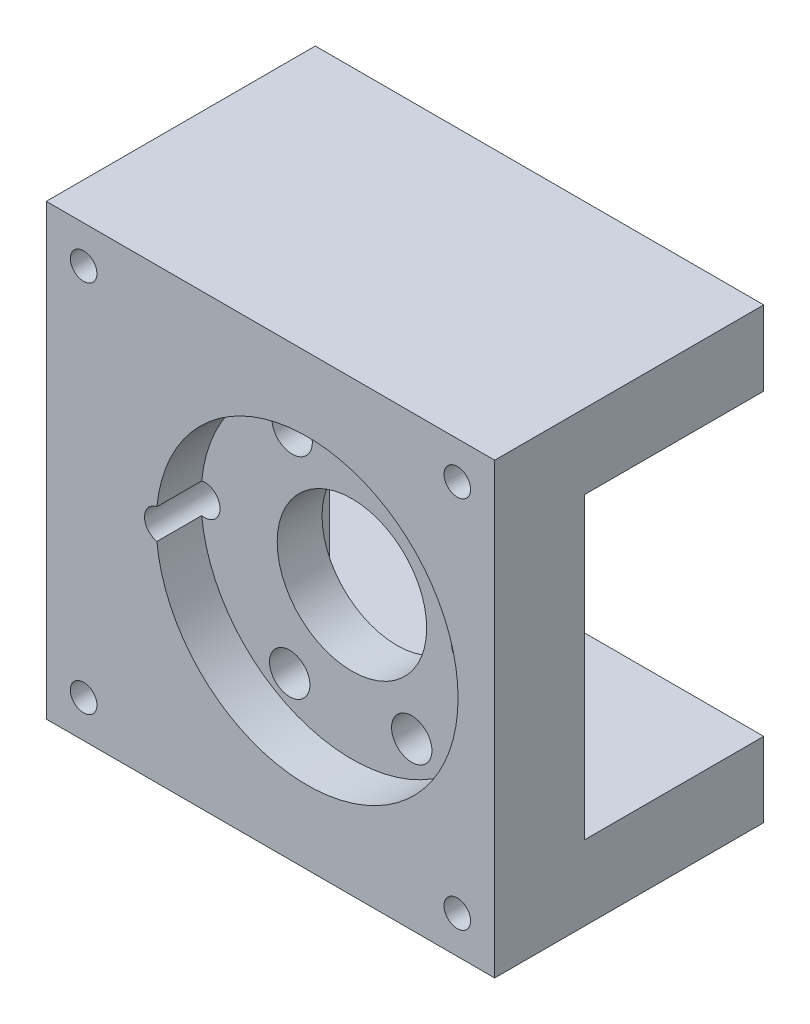
ISO-10303-21;
HEADER;
FILE_DESCRIPTION(('STEP AP214'),'2;1');
FILE_NAME('part.step','',(''),(''),'','','');
FILE_SCHEMA(('AUTOMOTIVE_DESIGN { 1 0 10303 214 1 1 1 1 }'));
ENDSEC;
DATA;
#1=APPLICATION_CONTEXT('core data for automotive mechanical design processes');
#2=APPLICATION_PROTOCOL_DEFINITION('international standard','automotive_design',2000,#1);
#3=PRODUCT_CONTEXT('',#1,'mechanical');
#4=PRODUCT('Part','Part','',(#3));
#5=PRODUCT_RELATED_PRODUCT_CATEGORY('part','',(#4));
#6=PRODUCT_DEFINITION_FORMATION('','',#4);
#7=PRODUCT_DEFINITION_CONTEXT('part definition',#1,'design');
#8=PRODUCT_DEFINITION('design','',#6,#7);
#9=PRODUCT_DEFINITION_SHAPE('','',#8);
#10=(LENGTH_UNIT() NAMED_UNIT(*) SI_UNIT(.MILLI.,.METRE.));
#11=(NAMED_UNIT(*) PLANE_ANGLE_UNIT() SI_UNIT($,.RADIAN.));
#12=(NAMED_UNIT(*) SI_UNIT($,.STERADIAN.) SOLID_ANGLE_UNIT());
#13=UNCERTAINTY_MEASURE_WITH_UNIT(LENGTH_MEASURE(1.E-05),#10,'distance_accuracy_value','');
#14=(GEOMETRIC_REPRESENTATION_CONTEXT(3) GLOBAL_UNCERTAINTY_ASSIGNED_CONTEXT((#13)) GLOBAL_UNIT_ASSIGNED_CONTEXT((#10,
#11,#12)) REPRESENTATION_CONTEXT('',''));
#15=CARTESIAN_POINT('',(0.,0.,0.));
#16=DIRECTION('',(0.,0.,1.));
#17=DIRECTION('',(1.,0.,0.));
#18=AXIS2_PLACEMENT_3D('',#15,#16,#17);
#19=CARTESIAN_POINT('',(0.,0.,9.));
#20=DIRECTION('',(0.,0.,-1.));
#21=DIRECTION('',(-1.,0.,0.));
#22=AXIS2_PLACEMENT_3D('',#19,#20,#21);
#23=PLANE('',#22);
#24=CARTESIAN_POINT('',(7.599999986,0.,9.));
#25=DIRECTION('',(0.,0.,-1.));
#26=DIRECTION('',(-1.,0.,0.));
#27=AXIS2_PLACEMENT_3D('',#24,#25,#26);
#28=CIRCLE('',#27,2.);
#29=CARTESIAN_POINT('',(5.599999986,0.,9.));
#30=VERTEX_POINT('',#29);
#31=EDGE_CURVE('E180',#30,#30,#28,.T.);
#32=ORIENTED_EDGE('',*,*,#31,.F.);
#33=EDGE_LOOP('',(#32));
#34=FACE_BOUND('',#33,.T.);
#35=DIRECTION('',(1.,0.,0.));
#36=VECTOR('',#35,1.);
#37=CARTESIAN_POINT('',(30.,10.,9.));
#38=LINE('',#37,#36);
#39=CARTESIAN_POINT('',(0.,10.,9.));
#40=VERTEX_POINT('',#39);
#41=CARTESIAN_POINT('',(13.251999944,10.,9.));
#42=VERTEX_POINT('',#41);
#43=EDGE_CURVE('E56',#40,#42,#38,.T.);
#44=ORIENTED_EDGE('',*,*,#43,.T.);
#45=CARTESIAN_POINT('',(13.251999944,6.698,9.));
#46=DIRECTION('',(0.,0.,-1.));
#47=DIRECTION('',(-1.,0.,0.));
#48=AXIS2_PLACEMENT_3D('',#45,#46,#47);
#49=CIRCLE('',#48,3.302);
#50=CARTESIAN_POINT('',(9.949999944,6.698,9.));
#51=VERTEX_POINT('',#50);
#52=EDGE_CURVE('E12',#42,#51,#49,.F.);
#53=ORIENTED_EDGE('',*,*,#52,.T.);
#54=DIRECTION('',(0.,-1.,0.));
#55=VECTOR('',#54,1.);
#56=CARTESIAN_POINT('',(9.949999944,0.,9.));
#57=LINE('',#56,#55);
#58=CARTESIAN_POINT('',(9.949999944,-6.698,9.));
#59=VERTEX_POINT('',#58);
#60=EDGE_CURVE('E173',#51,#59,#57,.T.);
#61=ORIENTED_EDGE('',*,*,#60,.T.);
#62=CARTESIAN_POINT('',(13.251999944,-6.698,9.));
#63=DIRECTION('',(0.,0.,-1.));
#64=DIRECTION('',(-1.,0.,0.));
#65=AXIS2_PLACEMENT_3D('',#62,#63,#64);
#66=CIRCLE('',#65,3.302);
#67=CARTESIAN_POINT('',(13.251999944,-10.,9.));
#68=VERTEX_POINT('',#67);
#69=EDGE_CURVE('E50',#59,#68,#66,.F.);
#70=ORIENTED_EDGE('',*,*,#69,.T.);
#71=DIRECTION('',(-1.,0.,0.));
#72=VECTOR('',#71,1.);
#73=CARTESIAN_POINT('',(30.,-10.,9.));
#74=LINE('',#73,#72);
#75=CARTESIAN_POINT('',(0.,-10.,9.));
#76=VERTEX_POINT('',#75);
#77=EDGE_CURVE('E228',#68,#76,#74,.T.);
#78=ORIENTED_EDGE('',*,*,#77,.T.);
#79=DIRECTION('',(0.,1.,0.));
#80=VECTOR('',#79,1.);
#81=CARTESIAN_POINT('',(0.,10.,9.));
#82=LINE('',#81,#80);
#83=EDGE_CURVE('E230',#76,#40,#82,.T.);
#84=ORIENTED_EDGE('',*,*,#83,.T.);
#85=EDGE_LOOP('',(#44,#53,#61,#70,#78,#84));
#86=FACE_BOUND('',#85,.T.);
#87=ADVANCED_FACE('F42',(#34,#86),#23,.T.);
#88=CARTESIAN_POINT('',(17.449999944,0.,18.));
#89=DIRECTION('',(0.,0.,-1.));
#90=DIRECTION('',(-1.,0.,0.));
#91=AXIS2_PLACEMENT_3D('',#88,#89,#90);
#92=CYLINDRICAL_SURFACE('',#91,5.);
#93=CARTESIAN_POINT('',(17.449999944,0.,11.999999892));
#94=DIRECTION('',(0.,0.,1.));
#95=DIRECTION('',(1.,0.,0.));
#96=AXIS2_PLACEMENT_3D('',#93,#94,#95);
#97=CIRCLE('',#96,5.);
#98=CARTESIAN_POINT('',(22.449999944,0.,11.999999892));
#99=VERTEX_POINT('',#98);
#100=EDGE_CURVE('E167',#99,#99,#97,.T.);
#101=ORIENTED_EDGE('',*,*,#100,.F.);
#102=EDGE_LOOP('',(#101));
#103=FACE_BOUND('',#102,.T.);
#104=CARTESIAN_POINT('',(17.449999944,0.,15.));
#105=DIRECTION('',(0.,0.,1.));
#106=DIRECTION('',(1.,0.,0.));
#107=AXIS2_PLACEMENT_3D('',#104,#105,#106);
#108=CIRCLE('',#107,5.);
#109=CARTESIAN_POINT('',(22.449999944,0.,15.));
#110=VERTEX_POINT('',#109);
#111=EDGE_CURVE('E191',#110,#110,#108,.T.);
#112=ORIENTED_EDGE('',*,*,#111,.T.);
#113=EDGE_LOOP('',(#112));
#114=FACE_BOUND('',#113,.T.);
#115=ADVANCED_FACE('F338',(#103,#114),#92,.F.);
#116=CARTESIAN_POINT('',(7.599999986,0.,18.));
#117=DIRECTION('',(0.,0.,-1.));
#118=DIRECTION('',(-1.,0.,0.));
#119=AXIS2_PLACEMENT_3D('',#116,#117,#118);
#120=CYLINDRICAL_SURFACE('',#119,1.025);
#121=DIRECTION('',(0.,0.,1.));
#122=VECTOR('',#121,1.);
#123=CARTESIAN_POINT('',(7.40015857258951,-1.00533000029149,-28.531668498232));
#124=LINE('',#123,#122);
#125=CARTESIAN_POINT('',(7.40015857258951,-1.00533000029149,15.));
#126=VERTEX_POINT('',#125);
#127=CARTESIAN_POINT('',(7.40015857258951,-1.00533000029149,18.));
#128=VERTEX_POINT('',#127);
#129=EDGE_CURVE('E192',#126,#128,#124,.T.);
#130=ORIENTED_EDGE('',*,*,#129,.F.);
#131=CARTESIAN_POINT('',(7.599999986,0.,15.));
#132=DIRECTION('',(0.,0.,1.));
#133=DIRECTION('',(1.,0.,0.));
#134=AXIS2_PLACEMENT_3D('',#131,#132,#133);
#135=CIRCLE('',#134,1.025);
#136=CARTESIAN_POINT('',(7.40015857258951,1.00533000029149,15.));
#137=VERTEX_POINT('',#136);
#138=EDGE_CURVE('E193',#126,#137,#135,.T.);
#139=ORIENTED_EDGE('',*,*,#138,.T.);
#140=DIRECTION('',(0.,0.,1.));
#141=VECTOR('',#140,1.);
#142=CARTESIAN_POINT('',(7.40015857258951,1.00533000029149,-28.531668498232));
#143=LINE('',#142,#141);
#144=CARTESIAN_POINT('',(7.40015857258951,1.00533000029149,18.));
#145=VERTEX_POINT('',#144);
#146=EDGE_CURVE('E188',#137,#145,#143,.T.);
#147=ORIENTED_EDGE('',*,*,#146,.T.);
#148=CARTESIAN_POINT('',(7.599999986,0.,18.));
#149=DIRECTION('',(0.,0.,1.));
#150=DIRECTION('',(1.,0.,0.));
#151=AXIS2_PLACEMENT_3D('',#148,#149,#150);
#152=CIRCLE('',#151,1.025);
#153=EDGE_CURVE('E255',#145,#128,#152,.T.);
#154=ORIENTED_EDGE('',*,*,#153,.T.);
#155=EDGE_LOOP('',(#130,#139,#147,#154));
#156=FACE_BOUND('',#155,.T.);
#157=CARTESIAN_POINT('',(7.599999986,0.,8.6));
#158=DIRECTION('',(0.,0.,1.));
#159=DIRECTION('',(1.,0.,0.));
#160=AXIS2_PLACEMENT_3D('',#157,#158,#159);
#161=CIRCLE('',#160,1.025);
#162=CARTESIAN_POINT('',(8.624999986,0.,8.6));
#163=VERTEX_POINT('',#162);
#164=EDGE_CURVE('E183',#163,#163,#161,.T.);
#165=ORIENTED_EDGE('',*,*,#164,.F.);
#166=EDGE_LOOP('',(#165));
#167=FACE_BOUND('',#166,.T.);
#168=ADVANCED_FACE('F344',(#156,#167),#120,.F.);
#169=CARTESIAN_POINT('',(0.,0.,0.));
#170=DIRECTION('',(0.,0.,1.));
#171=DIRECTION('',(1.,0.,0.));
#172=AXIS2_PLACEMENT_3D('',#169,#170,#171);
#173=PLANE('',#172);
#174=CARTESIAN_POINT('',(27.5,12.5,0.));
#175=DIRECTION('',(0.,0.,-1.));
#176=DIRECTION('',(-1.,0.,0.));
#177=AXIS2_PLACEMENT_3D('',#174,#175,#176);
#178=CIRCLE('',#177,0.888999999999987);
#179=CARTESIAN_POINT('',(26.611,12.5,0.));
#180=VERTEX_POINT('',#179);
#181=EDGE_CURVE('E196',#180,#180,#178,.T.);
#182=ORIENTED_EDGE('',*,*,#181,.F.);
#183=EDGE_LOOP('',(#182));
#184=FACE_BOUND('',#183,.T.);
#185=CARTESIAN_POINT('',(2.5,12.5,0.));
#186=DIRECTION('',(0.,0.,-1.));
#187=DIRECTION('',(-1.,0.,0.));
#188=AXIS2_PLACEMENT_3D('',#185,#186,#187);
#189=CIRCLE('',#188,0.888999999999987);
#190=CARTESIAN_POINT('',(1.61100000000001,12.5,0.));
#191=VERTEX_POINT('',#190);
#192=EDGE_CURVE('E221',#191,#191,#189,.T.);
#193=ORIENTED_EDGE('',*,*,#192,.F.);
#194=EDGE_LOOP('',(#193));
#195=FACE_BOUND('',#194,.T.);
#196=DIRECTION('',(0.,1.,0.));
#197=VECTOR('',#196,1.);
#198=CARTESIAN_POINT('',(30.,0.,0.));
#199=LINE('',#198,#197);
#200=CARTESIAN_POINT('',(30.,10.,0.));
#201=VERTEX_POINT('',#200);
#202=CARTESIAN_POINT('',(30.,15.,0.));
#203=VERTEX_POINT('',#202);
#204=EDGE_CURVE('E261',#201,#203,#199,.T.);
#205=ORIENTED_EDGE('',*,*,#204,.F.);
#206=DIRECTION('',(1.,0.,0.));
#207=VECTOR('',#206,1.);
#208=CARTESIAN_POINT('',(30.,10.,0.));
#209=LINE('',#208,#207);
#210=CARTESIAN_POINT('',(0.,10.,0.));
#211=VERTEX_POINT('',#210);
#212=EDGE_CURVE('E231',#211,#201,#209,.T.);
#213=ORIENTED_EDGE('',*,*,#212,.F.);
#214=DIRECTION('',(0.,1.,0.));
#215=VECTOR('',#214,1.);
#216=CARTESIAN_POINT('',(0.,0.,0.));
#217=LINE('',#216,#215);
#218=CARTESIAN_POINT('',(0.,15.,0.));
#219=VERTEX_POINT('',#218);
#220=EDGE_CURVE('E266',#211,#219,#217,.T.);
#221=ORIENTED_EDGE('',*,*,#220,.T.);
#222=DIRECTION('',(1.,0.,0.));
#223=VECTOR('',#222,1.);
#224=CARTESIAN_POINT('',(0.,15.,0.));
#225=LINE('',#224,#223);
#226=EDGE_CURVE('E263',#219,#203,#225,.T.);
#227=ORIENTED_EDGE('',*,*,#226,.T.);
#228=EDGE_LOOP('',(#205,#213,#221,#227));
#229=FACE_BOUND('',#228,.T.);
#230=ADVANCED_FACE('F307',(#184,#195,#229),#173,.F.);
#231=CARTESIAN_POINT('',(0.,-15.,18.));
#232=DIRECTION('',(0.,1.,0.));
#233=DIRECTION('',(0.,0.,1.));
#234=AXIS2_PLACEMENT_3D('',#231,#232,#233);
#235=PLANE('',#234);
#236=DIRECTION('',(1.,0.,0.));
#237=VECTOR('',#236,1.);
#238=CARTESIAN_POINT('',(0.,-15.,0.));
#239=LINE('',#238,#237);
#240=CARTESIAN_POINT('',(0.,-15.,0.));
#241=VERTEX_POINT('',#240);
#242=CARTESIAN_POINT('',(30.,-15.,0.));
#243=VERTEX_POINT('',#242);
#244=EDGE_CURVE('E238',#241,#243,#239,.T.);
#245=ORIENTED_EDGE('',*,*,#244,.T.);
#246=DIRECTION('',(0.,0.,-1.));
#247=VECTOR('',#246,1.);
#248=CARTESIAN_POINT('',(30.,-15.,18.));
#249=LINE('',#248,#247);
#250=CARTESIAN_POINT('',(30.,-15.,18.));
#251=VERTEX_POINT('',#250);
#252=EDGE_CURVE('E276',#251,#243,#249,.T.);
#253=ORIENTED_EDGE('',*,*,#252,.F.);
#254=DIRECTION('',(1.,0.,0.));
#255=VECTOR('',#254,1.);
#256=CARTESIAN_POINT('',(0.,-15.,18.));
#257=LINE('',#256,#255);
#258=CARTESIAN_POINT('',(0.,-15.,18.));
#259=VERTEX_POINT('',#258);
#260=EDGE_CURVE('E243',#259,#251,#257,.T.);
#261=ORIENTED_EDGE('',*,*,#260,.F.);
#262=DIRECTION('',(0.,0.,-1.));
#263=VECTOR('',#262,1.);
#264=CARTESIAN_POINT('',(0.,-15.,18.));
#265=LINE('',#264,#263);
#266=EDGE_CURVE('E258',#259,#241,#265,.T.);
#267=ORIENTED_EDGE('',*,*,#266,.T.);
#268=EDGE_LOOP('',(#245,#253,#261,#267));
#269=FACE_BOUND('',#268,.T.);
#270=ADVANCED_FACE('F319',(#269),#235,.F.);
#271=CARTESIAN_POINT('',(30.,0.,18.));
#272=DIRECTION('',(-1.,0.,0.));
#273=DIRECTION('',(0.,0.,1.));
#274=AXIS2_PLACEMENT_3D('',#271,#272,#273);
#275=PLANE('',#274);
#276=DIRECTION('',(0.,-1.,0.));
#277=VECTOR('',#276,1.);
#278=CARTESIAN_POINT('',(30.,0.,11.999999892));
#279=LINE('',#278,#277);
#280=CARTESIAN_POINT('',(30.,10.,11.999999892));
#281=VERTEX_POINT('',#280);
#282=CARTESIAN_POINT('',(30.,-10.,11.999999892));
#283=VERTEX_POINT('',#282);
#284=EDGE_CURVE('E148',#281,#283,#279,.T.);
#285=ORIENTED_EDGE('',*,*,#284,.F.);
#286=DIRECTION('',(0.,0.,-1.));
#287=VECTOR('',#286,1.);
#288=CARTESIAN_POINT('',(30.,10.,9.));
#289=LINE('',#288,#287);
#290=EDGE_CURVE('E236',#281,#201,#289,.T.);
#291=ORIENTED_EDGE('',*,*,#290,.T.);
#292=ORIENTED_EDGE('',*,*,#204,.T.);
#293=DIRECTION('',(0.,0.,-1.));
#294=VECTOR('',#293,1.);
#295=CARTESIAN_POINT('',(30.,15.,18.));
#296=LINE('',#295,#294);
#297=CARTESIAN_POINT('',(30.,15.,18.));
#298=VERTEX_POINT('',#297);
#299=EDGE_CURVE('E273',#298,#203,#296,.T.);
#300=ORIENTED_EDGE('',*,*,#299,.F.);
#301=DIRECTION('',(0.,1.,0.));
#302=VECTOR('',#301,1.);
#303=CARTESIAN_POINT('',(30.,0.,18.));
#304=LINE('',#303,#302);
#305=EDGE_CURVE('E246',#251,#298,#304,.T.);
#306=ORIENTED_EDGE('',*,*,#305,.F.);
#307=ORIENTED_EDGE('',*,*,#252,.T.);
#308=CARTESIAN_POINT('',(30.,-10.,0.));
#309=VERTEX_POINT('',#308);
#310=EDGE_CURVE('E150',#243,#309,#199,.T.);
#311=ORIENTED_EDGE('',*,*,#310,.T.);
#312=DIRECTION('',(0.,0.,-1.));
#313=VECTOR('',#312,1.);
#314=CARTESIAN_POINT('',(30.,-10.,9.));
#315=LINE('',#314,#313);
#316=EDGE_CURVE('E143',#283,#309,#315,.T.);
#317=ORIENTED_EDGE('',*,*,#316,.F.);
#318=EDGE_LOOP('',(#285,#291,#292,#300,#306,#307,#311,#317));
#319=FACE_BOUND('',#318,.T.);
#320=ADVANCED_FACE('F145',(#319),#275,.F.);
#321=CARTESIAN_POINT('',(0.,15.,18.));
#322=DIRECTION('',(0.,1.,0.));
#323=DIRECTION('',(0.,0.,1.));
#324=AXIS2_PLACEMENT_3D('',#321,#322,#323);
#325=PLANE('',#324);
#326=ORIENTED_EDGE('',*,*,#226,.F.);
#327=DIRECTION('',(0.,0.,-1.));
#328=VECTOR('',#327,1.);
#329=CARTESIAN_POINT('',(0.,15.,18.));
#330=LINE('',#329,#328);
#331=CARTESIAN_POINT('',(0.,15.,18.));
#332=VERTEX_POINT('',#331);
#333=EDGE_CURVE('E270',#332,#219,#330,.T.);
#334=ORIENTED_EDGE('',*,*,#333,.F.);
#335=DIRECTION('',(1.,0.,0.));
#336=VECTOR('',#335,1.);
#337=CARTESIAN_POINT('',(0.,15.,18.));
#338=LINE('',#337,#336);
#339=EDGE_CURVE('E249',#332,#298,#338,.T.);
#340=ORIENTED_EDGE('',*,*,#339,.T.);
#341=ORIENTED_EDGE('',*,*,#299,.T.);
#342=EDGE_LOOP('',(#326,#334,#340,#341));
#343=FACE_BOUND('',#342,.T.);
#344=ADVANCED_FACE('F311',(#343),#325,.T.);
#345=CARTESIAN_POINT('',(0.,0.,18.));
#346=DIRECTION('',(-1.,0.,0.));
#347=DIRECTION('',(0.,0.,1.));
#348=AXIS2_PLACEMENT_3D('',#345,#346,#347);
#349=PLANE('',#348);
#350=DIRECTION('',(0.,0.,-1.));
#351=VECTOR('',#350,1.);
#352=CARTESIAN_POINT('',(0.,10.,9.));
#353=LINE('',#352,#351);
#354=EDGE_CURVE('E239',#40,#211,#353,.T.);
#355=ORIENTED_EDGE('',*,*,#354,.F.);
#356=ORIENTED_EDGE('',*,*,#83,.F.);
#357=DIRECTION('',(0.,0.,-1.));
#358=VECTOR('',#357,1.);
#359=CARTESIAN_POINT('',(0.,-10.,9.));
#360=LINE('',#359,#358);
#361=CARTESIAN_POINT('',(0.,-10.,0.));
#362=VERTEX_POINT('',#361);
#363=EDGE_CURVE('E153',#76,#362,#360,.T.);
#364=ORIENTED_EDGE('',*,*,#363,.T.);
#365=EDGE_CURVE('E247',#241,#362,#217,.T.);
#366=ORIENTED_EDGE('',*,*,#365,.F.);
#367=ORIENTED_EDGE('',*,*,#266,.F.);
#368=DIRECTION('',(0.,1.,0.));
#369=VECTOR('',#368,1.);
#370=CARTESIAN_POINT('',(0.,0.,18.));
#371=LINE('',#370,#369);
#372=EDGE_CURVE('E252',#259,#332,#371,.T.);
#373=ORIENTED_EDGE('',*,*,#372,.T.);
#374=ORIENTED_EDGE('',*,*,#333,.T.);
#375=ORIENTED_EDGE('',*,*,#220,.F.);
#376=EDGE_LOOP('',(#355,#356,#364,#366,#367,#373,#374,#375));
#377=FACE_BOUND('',#376,.T.);
#378=ADVANCED_FACE('F325',(#377),#349,.T.);
#379=CARTESIAN_POINT('',(0.,0.,18.));
#380=DIRECTION('',(0.,0.,1.));
#381=DIRECTION('',(1.,0.,0.));
#382=AXIS2_PLACEMENT_3D('',#379,#380,#381);
#383=PLANE('',#382);
#384=CARTESIAN_POINT('',(17.449999944,0.,18.));
#385=DIRECTION('',(0.,0.,1.));
#386=DIRECTION('',(1.,0.,0.));
#387=AXIS2_PLACEMENT_3D('',#384,#385,#386);
#388=CIRCLE('',#387,10.1);
#389=EDGE_CURVE('E189',#128,#145,#388,.T.);
#390=ORIENTED_EDGE('',*,*,#389,.F.);
#391=ORIENTED_EDGE('',*,*,#153,.F.);
#392=EDGE_LOOP('',(#390,#391));
#393=FACE_BOUND('',#392,.T.);
#394=CARTESIAN_POINT('',(27.5,12.5,18.));
#395=DIRECTION('',(0.,0.,-1.));
#396=DIRECTION('',(-1.,0.,0.));
#397=AXIS2_PLACEMENT_3D('',#394,#395,#396);
#398=CIRCLE('',#397,0.888999999999997);
#399=CARTESIAN_POINT('',(26.611,12.5,18.));
#400=VERTEX_POINT('',#399);
#401=EDGE_CURVE('E206',#400,#400,#398,.T.);
#402=ORIENTED_EDGE('',*,*,#401,.T.);
#403=EDGE_LOOP('',(#402));
#404=FACE_BOUND('',#403,.T.);
#405=CARTESIAN_POINT('',(27.5,-12.5,18.));
#406=DIRECTION('',(0.,0.,-1.));
#407=DIRECTION('',(-1.,0.,0.));
#408=AXIS2_PLACEMENT_3D('',#405,#406,#407);
#409=CIRCLE('',#408,0.888999999999997);
#410=CARTESIAN_POINT('',(26.611,-12.5,18.));
#411=VERTEX_POINT('',#410);
#412=EDGE_CURVE('E212',#411,#411,#409,.T.);
#413=ORIENTED_EDGE('',*,*,#412,.T.);
#414=EDGE_LOOP('',(#413));
#415=FACE_BOUND('',#414,.T.);
#416=CARTESIAN_POINT('',(2.5,-12.5,18.));
#417=DIRECTION('',(0.,0.,-1.));
#418=DIRECTION('',(-1.,0.,0.));
#419=AXIS2_PLACEMENT_3D('',#416,#417,#418);
#420=CIRCLE('',#419,0.888999999999997);
#421=CARTESIAN_POINT('',(1.611,-12.5,18.));
#422=VERTEX_POINT('',#421);
#423=EDGE_CURVE('E218',#422,#422,#420,.T.);
#424=ORIENTED_EDGE('',*,*,#423,.T.);
#425=EDGE_LOOP('',(#424));
#426=FACE_BOUND('',#425,.T.);
#427=CARTESIAN_POINT('',(2.5,12.5,18.));
#428=DIRECTION('',(0.,0.,-1.));
#429=DIRECTION('',(-1.,0.,0.));
#430=AXIS2_PLACEMENT_3D('',#427,#428,#429);
#431=CIRCLE('',#430,0.888999999999997);
#432=CARTESIAN_POINT('',(1.611,12.5,18.));
#433=VERTEX_POINT('',#432);
#434=EDGE_CURVE('E224',#433,#433,#431,.T.);
#435=ORIENTED_EDGE('',*,*,#434,.T.);
#436=EDGE_LOOP('',(#435));
#437=FACE_BOUND('',#436,.T.);
#438=ORIENTED_EDGE('',*,*,#260,.T.);
#439=ORIENTED_EDGE('',*,*,#305,.T.);
#440=ORIENTED_EDGE('',*,*,#339,.F.);
#441=ORIENTED_EDGE('',*,*,#372,.F.);
#442=EDGE_LOOP('',(#438,#439,#440,#441));
#443=FACE_BOUND('',#442,.T.);
#444=ADVANCED_FACE('F317',(#393,#404,#415,#426,#437,#443),#383,.T.);
#445=CARTESIAN_POINT('',(27.5,-12.5,0.));
#446=DIRECTION('',(0.,0.,-1.));
#447=DIRECTION('',(-1.,0.,0.));
#448=AXIS2_PLACEMENT_3D('',#445,#446,#447);
#449=CIRCLE('',#448,0.888999999999987);
#450=CARTESIAN_POINT('',(26.611,-12.5,0.));
#451=VERTEX_POINT('',#450);
#452=EDGE_CURVE('E209',#451,#451,#449,.T.);
#453=ORIENTED_EDGE('',*,*,#452,.F.);
#454=EDGE_LOOP('',(#453));
#455=FACE_BOUND('',#454,.T.);
#456=CARTESIAN_POINT('',(2.5,-12.5,0.));
#457=DIRECTION('',(0.,0.,-1.));
#458=DIRECTION('',(-1.,0.,0.));
#459=AXIS2_PLACEMENT_3D('',#456,#457,#458);
#460=CIRCLE('',#459,0.888999999999987);
#461=CARTESIAN_POINT('',(1.61100000000001,-12.5,0.));
#462=VERTEX_POINT('',#461);
#463=EDGE_CURVE('E215',#462,#462,#460,.T.);
#464=ORIENTED_EDGE('',*,*,#463,.F.);
#465=EDGE_LOOP('',(#464));
#466=FACE_BOUND('',#465,.T.);
#467=ORIENTED_EDGE('',*,*,#365,.T.);
#468=DIRECTION('',(-1.,0.,0.));
#469=VECTOR('',#468,1.);
#470=CARTESIAN_POINT('',(30.,-10.,0.));
#471=LINE('',#470,#469);
#472=EDGE_CURVE('E227',#309,#362,#471,.T.);
#473=ORIENTED_EDGE('',*,*,#472,.F.);
#474=ORIENTED_EDGE('',*,*,#310,.F.);
#475=ORIENTED_EDGE('',*,*,#244,.F.);
#476=EDGE_LOOP('',(#467,#473,#474,#475));
#477=FACE_BOUND('',#476,.T.);
#478=ADVANCED_FACE('F323',(#455,#466,#477),#173,.F.);
#479=CARTESIAN_POINT('',(30.,10.,9.));
#480=DIRECTION('',(0.,1.,0.));
#481=DIRECTION('',(0.,0.,1.));
#482=AXIS2_PLACEMENT_3D('',#479,#480,#481);
#483=PLANE('',#482);
#484=DIRECTION('',(1.,0.,0.));
#485=VECTOR('',#484,1.);
#486=CARTESIAN_POINT('',(0.,10.,11.999999892));
#487=LINE('',#486,#485);
#488=CARTESIAN_POINT('',(13.251999944,10.,11.999999892));
#489=VERTEX_POINT('',#488);
#490=EDGE_CURVE('E164',#489,#281,#487,.T.);
#491=ORIENTED_EDGE('',*,*,#490,.F.);
#492=DIRECTION('',(0.,0.,-1.));
#493=VECTOR('',#492,1.);
#494=CARTESIAN_POINT('',(13.251999944,10.,9.));
#495=LINE('',#494,#493);
#496=EDGE_CURVE('E287',#489,#42,#495,.T.);
#497=ORIENTED_EDGE('',*,*,#496,.T.);
#498=ORIENTED_EDGE('',*,*,#43,.F.);
#499=ORIENTED_EDGE('',*,*,#354,.T.);
#500=ORIENTED_EDGE('',*,*,#212,.T.);
#501=ORIENTED_EDGE('',*,*,#290,.F.);
#502=EDGE_LOOP('',(#491,#497,#498,#499,#500,#501));
#503=FACE_BOUND('',#502,.T.);
#504=ADVANCED_FACE('F301',(#503),#483,.F.);
#505=CARTESIAN_POINT('',(30.,-10.,9.));
#506=DIRECTION('',(0.,-1.,0.));
#507=DIRECTION('',(0.,0.,-1.));
#508=AXIS2_PLACEMENT_3D('',#505,#506,#507);
#509=PLANE('',#508);
#510=ORIENTED_EDGE('',*,*,#77,.F.);
#511=DIRECTION('',(0.,0.,-1.));
#512=VECTOR('',#511,1.);
#513=CARTESIAN_POINT('',(13.251999944,-10.,9.));
#514=LINE('',#513,#512);
#515=CARTESIAN_POINT('',(13.251999944,-10.,11.999999892));
#516=VERTEX_POINT('',#515);
#517=EDGE_CURVE('E159',#68,#516,#514,.F.);
#518=ORIENTED_EDGE('',*,*,#517,.T.);
#519=DIRECTION('',(-1.,0.,0.));
#520=VECTOR('',#519,1.);
#521=CARTESIAN_POINT('',(0.,-10.,11.999999892));
#522=LINE('',#521,#520);
#523=EDGE_CURVE('E156',#283,#516,#522,.T.);
#524=ORIENTED_EDGE('',*,*,#523,.F.);
#525=ORIENTED_EDGE('',*,*,#316,.T.);
#526=ORIENTED_EDGE('',*,*,#472,.T.);
#527=ORIENTED_EDGE('',*,*,#363,.F.);
#528=EDGE_LOOP('',(#510,#518,#524,#525,#526,#527));
#529=FACE_BOUND('',#528,.T.);
#530=ADVANCED_FACE('F157',(#529),#509,.F.);
#531=CARTESIAN_POINT('',(2.5,12.5,0.));
#532=DIRECTION('',(0.,0.,-1.));
#533=DIRECTION('',(-1.,0.,0.));
#534=AXIS2_PLACEMENT_3D('',#531,#532,#533);
#535=CYLINDRICAL_SURFACE('',#534,0.888999999999992);
#536=ORIENTED_EDGE('',*,*,#434,.F.);
#537=EDGE_LOOP('',(#536));
#538=FACE_BOUND('',#537,.T.);
#539=ORIENTED_EDGE('',*,*,#192,.T.);
#540=EDGE_LOOP('',(#539));
#541=FACE_BOUND('',#540,.T.);
#542=ADVANCED_FACE('F349',(#538,#541),#535,.F.);
#543=CARTESIAN_POINT('',(2.5,-12.5,0.));
#544=DIRECTION('',(0.,0.,-1.));
#545=DIRECTION('',(-1.,0.,0.));
#546=AXIS2_PLACEMENT_3D('',#543,#544,#545);
#547=CYLINDRICAL_SURFACE('',#546,0.888999999999992);
#548=ORIENTED_EDGE('',*,*,#423,.F.);
#549=EDGE_LOOP('',(#548));
#550=FACE_BOUND('',#549,.T.);
#551=ORIENTED_EDGE('',*,*,#463,.T.);
#552=EDGE_LOOP('',(#551));
#553=FACE_BOUND('',#552,.T.);
#554=ADVANCED_FACE('F397',(#550,#553),#547,.F.);
#555=CARTESIAN_POINT('',(27.5,-12.5,0.));
#556=DIRECTION('',(0.,0.,-1.));
#557=DIRECTION('',(-1.,0.,0.));
#558=AXIS2_PLACEMENT_3D('',#555,#556,#557);
#559=CYLINDRICAL_SURFACE('',#558,0.888999999999992);
#560=ORIENTED_EDGE('',*,*,#412,.F.);
#561=EDGE_LOOP('',(#560));
#562=FACE_BOUND('',#561,.T.);
#563=ORIENTED_EDGE('',*,*,#452,.T.);
#564=EDGE_LOOP('',(#563));
#565=FACE_BOUND('',#564,.T.);
#566=ADVANCED_FACE('F394',(#562,#565),#559,.F.);
#567=CARTESIAN_POINT('',(27.5,12.5,0.));
#568=DIRECTION('',(0.,0.,-1.));
#569=DIRECTION('',(-1.,0.,0.));
#570=AXIS2_PLACEMENT_3D('',#567,#568,#569);
#571=CYLINDRICAL_SURFACE('',#570,0.888999999999992);
#572=ORIENTED_EDGE('',*,*,#401,.F.);
#573=EDGE_LOOP('',(#572));
#574=FACE_BOUND('',#573,.T.);
#575=ORIENTED_EDGE('',*,*,#181,.T.);
#576=EDGE_LOOP('',(#575));
#577=FACE_BOUND('',#576,.T.);
#578=ADVANCED_FACE('F389',(#574,#577),#571,.F.);
#579=CARTESIAN_POINT('',(17.449999944,0.,-28.531668498232));
#580=DIRECTION('',(0.,0.,1.));
#581=DIRECTION('',(1.,0.,0.));
#582=AXIS2_PLACEMENT_3D('',#579,#580,#581);
#583=CYLINDRICAL_SURFACE('',#582,10.1);
#584=CARTESIAN_POINT('',(17.449999944,0.,15.));
#585=DIRECTION('',(0.,0.,1.));
#586=DIRECTION('',(1.,0.,0.));
#587=AXIS2_PLACEMENT_3D('',#584,#585,#586);
#588=CIRCLE('',#587,10.1);
#589=EDGE_CURVE('E197',#137,#126,#588,.F.);
#590=ORIENTED_EDGE('',*,*,#589,.T.);
#591=ORIENTED_EDGE('',*,*,#129,.T.);
#592=ORIENTED_EDGE('',*,*,#389,.T.);
#593=ORIENTED_EDGE('',*,*,#146,.F.);
#594=EDGE_LOOP('',(#590,#591,#592,#593));
#595=FACE_BOUND('',#594,.T.);
#596=ADVANCED_FACE('F382',(#595),#583,.F.);
#597=CARTESIAN_POINT('',(0.,0.,15.));
#598=DIRECTION('',(0.,0.,1.));
#599=DIRECTION('',(1.,0.,0.));
#600=AXIS2_PLACEMENT_3D('',#597,#598,#599);
#601=PLANE('',#600);
#602=CARTESIAN_POINT('',(21.449999944,6.92820323027552,15.));
#603=DIRECTION('',(0.,0.,1.));
#604=DIRECTION('',(1.,0.,0.));
#605=AXIS2_PLACEMENT_3D('',#602,#603,#604);
#606=CIRCLE('',#605,1.34999999999999);
#607=CARTESIAN_POINT('',(22.799999944,6.92820323027552,15.));
#608=VERTEX_POINT('',#607);
#609=EDGE_CURVE('E588',#608,#608,#606,.T.);
#610=ORIENTED_EDGE('',*,*,#609,.F.);
#611=EDGE_LOOP('',(#610));
#612=FACE_BOUND('',#611,.T.);
#613=CARTESIAN_POINT('',(13.449999944,6.92820323027552,15.));
#614=DIRECTION('',(0.,0.,1.));
#615=DIRECTION('',(1.,0.,0.));
#616=AXIS2_PLACEMENT_3D('',#613,#614,#615);
#617=CIRCLE('',#616,1.34999999999999);
#618=CARTESIAN_POINT('',(14.799999944,6.92820323027552,15.));
#619=VERTEX_POINT('',#618);
#620=EDGE_CURVE('E598',#619,#619,#617,.T.);
#621=ORIENTED_EDGE('',*,*,#620,.F.);
#622=EDGE_LOOP('',(#621));
#623=FACE_BOUND('',#622,.T.);
#624=CARTESIAN_POINT('',(13.2857176433025,-7.21274852186785,15.));
#625=DIRECTION('',(0.,0.,1.));
#626=DIRECTION('',(1.,0.,0.));
#627=AXIS2_PLACEMENT_3D('',#624,#625,#626);
#628=CIRCLE('',#627,1.34999999999999);
#629=CARTESIAN_POINT('',(14.6357176433025,-7.21274852186785,15.));
#630=VERTEX_POINT('',#629);
#631=EDGE_CURVE('E604',#630,#630,#628,.T.);
#632=ORIENTED_EDGE('',*,*,#631,.F.);
#633=EDGE_LOOP('',(#632));
#634=FACE_BOUND('',#633,.T.);
#635=CARTESIAN_POINT('',(21.449999944,-6.92820323027552,15.));
#636=DIRECTION('',(0.,0.,1.));
#637=DIRECTION('',(1.,0.,0.));
#638=AXIS2_PLACEMENT_3D('',#635,#636,#637);
#639=CIRCLE('',#638,1.34999999999999);
#640=CARTESIAN_POINT('',(22.799999944,-6.92820323027552,15.));
#641=VERTEX_POINT('',#640);
#642=EDGE_CURVE('E610',#641,#641,#639,.T.);
#643=ORIENTED_EDGE('',*,*,#642,.F.);
#644=EDGE_LOOP('',(#643));
#645=FACE_BOUND('',#644,.T.);
#646=CARTESIAN_POINT('',(25.449999944,0.,15.));
#647=DIRECTION('',(0.,0.,1.));
#648=DIRECTION('',(1.,0.,0.));
#649=AXIS2_PLACEMENT_3D('',#646,#647,#648);
#650=CIRCLE('',#649,1.34999999999999);
#651=CARTESIAN_POINT('',(26.799999944,0.,15.));
#652=VERTEX_POINT('',#651);
#653=EDGE_CURVE('E179',#652,#652,#650,.T.);
#654=ORIENTED_EDGE('',*,*,#653,.F.);
#655=EDGE_LOOP('',(#654));
#656=FACE_BOUND('',#655,.T.);
#657=ORIENTED_EDGE('',*,*,#111,.F.);
#658=EDGE_LOOP('',(#657));
#659=FACE_BOUND('',#658,.T.);
#660=ORIENTED_EDGE('',*,*,#589,.F.);
#661=ORIENTED_EDGE('',*,*,#138,.F.);
#662=EDGE_LOOP('',(#660,#661));
#663=FACE_BOUND('',#662,.T.);
#664=ADVANCED_FACE('F377',(#612,#623,#634,#645,#656,#659,#663),#601,.T.);
#665=CARTESIAN_POINT('',(7.599999986,0.,-5.65685424949238));
#666=DIRECTION('',(0.,0.,1.));
#667=DIRECTION('',(1.,0.,0.));
#668=AXIS2_PLACEMENT_3D('',#665,#666,#667);
#669=CYLINDRICAL_SURFACE('',#668,2.);
#670=CARTESIAN_POINT('',(7.599999986,0.,8.6));
#671=DIRECTION('',(0.,0.,1.));
#672=DIRECTION('',(1.,0.,0.));
#673=AXIS2_PLACEMENT_3D('',#670,#671,#672);
#674=CIRCLE('',#673,2.);
#675=CARTESIAN_POINT('',(9.599999986,0.,8.6));
#676=VERTEX_POINT('',#675);
#677=EDGE_CURVE('E176',#676,#676,#674,.T.);
#678=ORIENTED_EDGE('',*,*,#677,.T.);
#679=EDGE_LOOP('',(#678));
#680=FACE_BOUND('',#679,.T.);
#681=ORIENTED_EDGE('',*,*,#31,.T.);
#682=EDGE_LOOP('',(#681));
#683=FACE_BOUND('',#682,.T.);
#684=ADVANCED_FACE('F371',(#680,#683),#669,.T.);
#685=CARTESIAN_POINT('',(0.,0.,8.6));
#686=DIRECTION('',(0.,0.,1.));
#687=DIRECTION('',(1.,0.,0.));
#688=AXIS2_PLACEMENT_3D('',#685,#686,#687);
#689=PLANE('',#688);
#690=ORIENTED_EDGE('',*,*,#164,.T.);
#691=EDGE_LOOP('',(#690));
#692=FACE_BOUND('',#691,.T.);
#693=ORIENTED_EDGE('',*,*,#677,.F.);
#694=EDGE_LOOP('',(#693));
#695=FACE_BOUND('',#694,.T.);
#696=ADVANCED_FACE('F368',(#692,#695),#689,.F.);
#697=CARTESIAN_POINT('',(9.949999944,0.,52.3196484796601));
#698=DIRECTION('',(1.,0.,0.));
#699=DIRECTION('',(0.,1.,0.));
#700=AXIS2_PLACEMENT_3D('',#697,#698,#699);
#701=PLANE('',#700);
#702=DIRECTION('',(0.,-1.,0.));
#703=VECTOR('',#702,1.);
#704=CARTESIAN_POINT('',(9.949999944,0.,11.999999892));
#705=LINE('',#704,#703);
#706=CARTESIAN_POINT('',(9.949999944,6.698,11.999999892));
#707=VERTEX_POINT('',#706);
#708=CARTESIAN_POINT('',(9.949999944,-6.698,11.999999892));
#709=VERTEX_POINT('',#708);
#710=EDGE_CURVE('E161',#707,#709,#705,.T.);
#711=ORIENTED_EDGE('',*,*,#710,.T.);
#712=DIRECTION('',(0.,0.,-1.));
#713=VECTOR('',#712,1.);
#714=CARTESIAN_POINT('',(9.949999944,-6.698,52.3196484796601));
#715=LINE('',#714,#713);
#716=EDGE_CURVE('E280',#709,#59,#715,.T.);
#717=ORIENTED_EDGE('',*,*,#716,.T.);
#718=ORIENTED_EDGE('',*,*,#60,.F.);
#719=DIRECTION('',(0.,0.,-1.));
#720=VECTOR('',#719,1.);
#721=CARTESIAN_POINT('',(9.949999944,6.698,52.3196484796601));
#722=LINE('',#721,#720);
#723=EDGE_CURVE('E278',#51,#707,#722,.F.);
#724=ORIENTED_EDGE('',*,*,#723,.T.);
#725=EDGE_LOOP('',(#711,#717,#718,#724));
#726=FACE_BOUND('',#725,.T.);
#727=ADVANCED_FACE('F296',(#726),#701,.T.);
#728=CARTESIAN_POINT('',(0.,0.,11.999999892));
#729=DIRECTION('',(0.,0.,1.));
#730=DIRECTION('',(1.,0.,0.));
#731=AXIS2_PLACEMENT_3D('',#728,#729,#730);
#732=PLANE('',#731);
#733=CARTESIAN_POINT('',(21.449999944,6.92820323027552,11.999999892));
#734=DIRECTION('',(0.,0.,-1.));
#735=DIRECTION('',(-1.,0.,0.));
#736=AXIS2_PLACEMENT_3D('',#733,#734,#735);
#737=CIRCLE('',#736,1.34999999999999);
#738=CARTESIAN_POINT('',(20.099999944,6.92820323027552,11.999999892));
#739=VERTEX_POINT('',#738);
#740=EDGE_CURVE('E591',#739,#739,#737,.T.);
#741=ORIENTED_EDGE('',*,*,#740,.F.);
#742=EDGE_LOOP('',(#741));
#743=FACE_BOUND('',#742,.T.);
#744=CARTESIAN_POINT('',(13.449999944,6.92820323027552,11.999999892));
#745=DIRECTION('',(0.,0.,-1.));
#746=DIRECTION('',(-1.,0.,0.));
#747=AXIS2_PLACEMENT_3D('',#744,#745,#746);
#748=CIRCLE('',#747,1.34999999999999);
#749=CARTESIAN_POINT('',(12.099999944,6.92820323027552,11.999999892));
#750=VERTEX_POINT('',#749);
#751=EDGE_CURVE('E593',#750,#750,#748,.T.);
#752=ORIENTED_EDGE('',*,*,#751,.F.);
#753=EDGE_LOOP('',(#752));
#754=FACE_BOUND('',#753,.T.);
#755=CARTESIAN_POINT('',(13.2857176433025,-7.21274852186785,11.999999892));
#756=DIRECTION('',(0.,0.,-1.));
#757=DIRECTION('',(-1.,0.,0.));
#758=AXIS2_PLACEMENT_3D('',#755,#756,#757);
#759=CIRCLE('',#758,1.34999999999999);
#760=CARTESIAN_POINT('',(11.9357176433026,-7.21274852186785,11.999999892));
#761=VERTEX_POINT('',#760);
#762=EDGE_CURVE('E601',#761,#761,#759,.T.);
#763=ORIENTED_EDGE('',*,*,#762,.F.);
#764=EDGE_LOOP('',(#763));
#765=FACE_BOUND('',#764,.T.);
#766=CARTESIAN_POINT('',(21.449999944,-6.92820323027552,11.999999892));
#767=DIRECTION('',(0.,0.,-1.));
#768=DIRECTION('',(-1.,0.,0.));
#769=AXIS2_PLACEMENT_3D('',#766,#767,#768);
#770=CIRCLE('',#769,1.34999999999999);
#771=CARTESIAN_POINT('',(20.099999944,-6.92820323027552,11.999999892));
#772=VERTEX_POINT('',#771);
#773=EDGE_CURVE('E607',#772,#772,#770,.T.);
#774=ORIENTED_EDGE('',*,*,#773,.F.);
#775=EDGE_LOOP('',(#774));
#776=FACE_BOUND('',#775,.T.);
#777=CARTESIAN_POINT('',(25.449999944,0.,11.999999892));
#778=DIRECTION('',(0.,0.,-1.));
#779=DIRECTION('',(-1.,0.,0.));
#780=AXIS2_PLACEMENT_3D('',#777,#778,#779);
#781=CIRCLE('',#780,1.34999999999999);
#782=CARTESIAN_POINT('',(24.099999944,0.,11.999999892));
#783=VERTEX_POINT('',#782);
#784=EDGE_CURVE('E613',#783,#783,#781,.T.);
#785=ORIENTED_EDGE('',*,*,#784,.F.);
#786=EDGE_LOOP('',(#785));
#787=FACE_BOUND('',#786,.T.);
#788=ORIENTED_EDGE('',*,*,#100,.T.);
#789=EDGE_LOOP('',(#788));
#790=FACE_BOUND('',#789,.T.);
#791=ORIENTED_EDGE('',*,*,#523,.T.);
#792=CARTESIAN_POINT('',(13.251999944,-6.698,11.999999892));
#793=DIRECTION('',(0.,0.,1.));
#794=DIRECTION('',(1.,0.,0.));
#795=AXIS2_PLACEMENT_3D('',#792,#793,#794);
#796=CIRCLE('',#795,3.302);
#797=EDGE_CURVE('E285',#516,#709,#796,.F.);
#798=ORIENTED_EDGE('',*,*,#797,.T.);
#799=ORIENTED_EDGE('',*,*,#710,.F.);
#800=CARTESIAN_POINT('',(13.251999944,6.698,11.999999892));
#801=DIRECTION('',(0.,0.,1.));
#802=DIRECTION('',(1.,0.,0.));
#803=AXIS2_PLACEMENT_3D('',#800,#801,#802);
#804=CIRCLE('',#803,3.302);
#805=EDGE_CURVE('E64',#707,#489,#804,.F.);
#806=ORIENTED_EDGE('',*,*,#805,.T.);
#807=ORIENTED_EDGE('',*,*,#490,.T.);
#808=ORIENTED_EDGE('',*,*,#284,.T.);
#809=EDGE_LOOP('',(#791,#798,#799,#806,#807,#808));
#810=FACE_BOUND('',#809,.T.);
#811=ADVANCED_FACE('F163',(#743,#754,#765,#776,#787,#790,#810),#732,.F.);
#812=CARTESIAN_POINT('',(13.251999944,-6.698,52.3196484796601));
#813=DIRECTION('',(0.,0.,-1.));
#814=DIRECTION('',(-1.,0.,0.));
#815=AXIS2_PLACEMENT_3D('',#812,#813,#814);
#816=CYLINDRICAL_SURFACE('',#815,3.302);
#817=ORIENTED_EDGE('',*,*,#797,.F.);
#818=ORIENTED_EDGE('',*,*,#517,.F.);
#819=ORIENTED_EDGE('',*,*,#69,.F.);
#820=ORIENTED_EDGE('',*,*,#716,.F.);
#821=EDGE_LOOP('',(#817,#818,#819,#820));
#822=FACE_BOUND('',#821,.T.);
#823=ADVANCED_FACE('F294',(#822),#816,.F.);
#824=CARTESIAN_POINT('',(13.251999944,6.698,9.));
#825=DIRECTION('',(0.,0.,-1.));
#826=DIRECTION('',(-1.,0.,0.));
#827=AXIS2_PLACEMENT_3D('',#824,#825,#826);
#828=CYLINDRICAL_SURFACE('',#827,3.302);
#829=ORIENTED_EDGE('',*,*,#805,.F.);
#830=ORIENTED_EDGE('',*,*,#723,.F.);
#831=ORIENTED_EDGE('',*,*,#52,.F.);
#832=ORIENTED_EDGE('',*,*,#496,.F.);
#833=EDGE_LOOP('',(#829,#830,#831,#832));
#834=FACE_BOUND('',#833,.T.);
#835=ADVANCED_FACE('F44',(#834),#828,.F.);
#836=CARTESIAN_POINT('',(25.449999944,0.,11.999999892));
#837=DIRECTION('',(0.,0.,-1.));
#838=DIRECTION('',(-1.,0.,0.));
#839=AXIS2_PLACEMENT_3D('',#836,#837,#838);
#840=CYLINDRICAL_SURFACE('',#839,1.34999999999999);
#841=ORIENTED_EDGE('',*,*,#653,.T.);
#842=EDGE_LOOP('',(#841));
#843=FACE_BOUND('',#842,.T.);
#844=ORIENTED_EDGE('',*,*,#784,.T.);
#845=EDGE_LOOP('',(#844));
#846=FACE_BOUND('',#845,.T.);
#847=ADVANCED_FACE('F532',(#843,#846),#840,.F.);
#848=CARTESIAN_POINT('',(21.449999944,-6.92820323027552,11.999999892));
#849=DIRECTION('',(0.,0.,-1.));
#850=DIRECTION('',(-1.,0.,0.));
#851=AXIS2_PLACEMENT_3D('',#848,#849,#850);
#852=CYLINDRICAL_SURFACE('',#851,1.34999999999999);
#853=ORIENTED_EDGE('',*,*,#642,.T.);
#854=EDGE_LOOP('',(#853));
#855=FACE_BOUND('',#854,.T.);
#856=ORIENTED_EDGE('',*,*,#773,.T.);
#857=EDGE_LOOP('',(#856));
#858=FACE_BOUND('',#857,.T.);
#859=ADVANCED_FACE('F538',(#855,#858),#852,.F.);
#860=CARTESIAN_POINT('',(13.2857176433025,-7.21274852186785,11.999999892));
#861=DIRECTION('',(0.,0.,-1.));
#862=DIRECTION('',(-1.,0.,0.));
#863=AXIS2_PLACEMENT_3D('',#860,#861,#862);
#864=CYLINDRICAL_SURFACE('',#863,1.34999999999999);
#865=ORIENTED_EDGE('',*,*,#631,.T.);
#866=EDGE_LOOP('',(#865));
#867=FACE_BOUND('',#866,.T.);
#868=ORIENTED_EDGE('',*,*,#762,.T.);
#869=EDGE_LOOP('',(#868));
#870=FACE_BOUND('',#869,.T.);
#871=ADVANCED_FACE('F547',(#867,#870),#864,.F.);
#872=CARTESIAN_POINT('',(13.449999944,6.92820323027552,11.999999892));
#873=DIRECTION('',(0.,0.,-1.));
#874=DIRECTION('',(-1.,0.,0.));
#875=AXIS2_PLACEMENT_3D('',#872,#873,#874);
#876=CYLINDRICAL_SURFACE('',#875,1.34999999999999);
#877=ORIENTED_EDGE('',*,*,#620,.T.);
#878=EDGE_LOOP('',(#877));
#879=FACE_BOUND('',#878,.T.);
#880=ORIENTED_EDGE('',*,*,#751,.T.);
#881=EDGE_LOOP('',(#880));
#882=FACE_BOUND('',#881,.T.);
#883=ADVANCED_FACE('F556',(#879,#882),#876,.F.);
#884=CARTESIAN_POINT('',(21.449999944,6.92820323027552,11.999999892));
#885=DIRECTION('',(0.,0.,-1.));
#886=DIRECTION('',(-1.,0.,0.));
#887=AXIS2_PLACEMENT_3D('',#884,#885,#886);
#888=CYLINDRICAL_SURFACE('',#887,1.34999999999999);
#889=ORIENTED_EDGE('',*,*,#609,.T.);
#890=EDGE_LOOP('',(#889));
#891=FACE_BOUND('',#890,.T.);
#892=ORIENTED_EDGE('',*,*,#740,.T.);
#893=EDGE_LOOP('',(#892));
#894=FACE_BOUND('',#893,.T.);
#895=ADVANCED_FACE('F565',(#891,#894),#888,.F.);
#896=CLOSED_SHELL('',(#87,#115,#168,#230,#270,#320,#344,#378,#444,#478,#504,#530,#542,#554,#566,
#578,#596,#664,#684,#696,#727,#811,#823,#835,#847,#859,#871,#883,#895));
#897=MANIFOLD_SOLID_BREP('B2',#896);
#898=ADVANCED_BREP_SHAPE_REPRESENTATION('',(#18,#897),#14);
#899=SHAPE_DEFINITION_REPRESENTATION(#9,#898);
ENDSEC;
END-ISO-10303-21;
